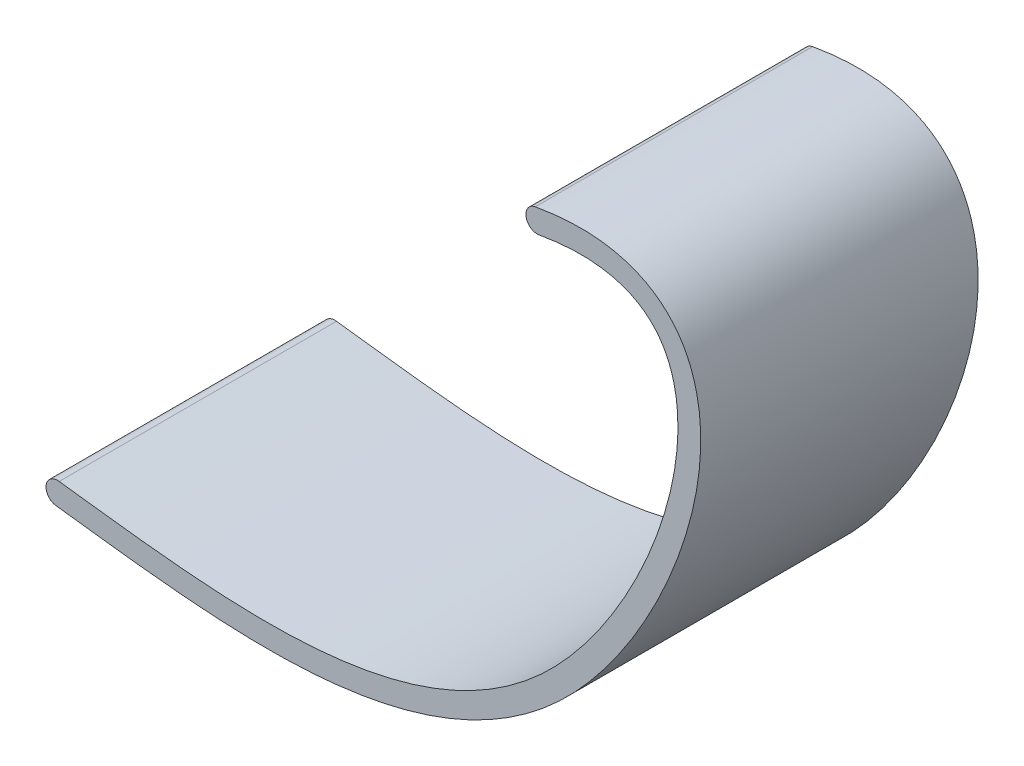
ISO-10303-21;
HEADER;
FILE_DESCRIPTION(('STEP AP214'),'2;1');
FILE_NAME('part.step','',(''),(''),'','','');
FILE_SCHEMA(('AUTOMOTIVE_DESIGN { 1 0 10303 214 1 1 1 1 }'));
ENDSEC;
DATA;
#1=APPLICATION_CONTEXT('core data for automotive mechanical design processes');
#2=APPLICATION_PROTOCOL_DEFINITION('international standard','automotive_design',2000,#1);
#3=PRODUCT_CONTEXT('',#1,'mechanical');
#4=PRODUCT('Part','Part','',(#3));
#5=PRODUCT_RELATED_PRODUCT_CATEGORY('part','',(#4));
#6=PRODUCT_DEFINITION_FORMATION('','',#4);
#7=PRODUCT_DEFINITION_CONTEXT('part definition',#1,'design');
#8=PRODUCT_DEFINITION('design','',#6,#7);
#9=PRODUCT_DEFINITION_SHAPE('','',#8);
#10=(LENGTH_UNIT() NAMED_UNIT(*) SI_UNIT(.MILLI.,.METRE.));
#11=(NAMED_UNIT(*) PLANE_ANGLE_UNIT() SI_UNIT($,.RADIAN.));
#12=(NAMED_UNIT(*) SI_UNIT($,.STERADIAN.) SOLID_ANGLE_UNIT());
#13=UNCERTAINTY_MEASURE_WITH_UNIT(LENGTH_MEASURE(1.E-05),#10,'distance_accuracy_value','');
#14=(GEOMETRIC_REPRESENTATION_CONTEXT(3) GLOBAL_UNCERTAINTY_ASSIGNED_CONTEXT((#13)) GLOBAL_UNIT_ASSIGNED_CONTEXT((#10,
#11,#12)) REPRESENTATION_CONTEXT('',''));
#15=CARTESIAN_POINT('',(0.,0.,0.));
#16=DIRECTION('',(0.,0.,1.));
#17=DIRECTION('',(1.,0.,0.));
#18=AXIS2_PLACEMENT_3D('',#15,#16,#17);
#19=CARTESIAN_POINT('',(10.2857672952948,-10.2788864664164,38.6715));
#20=DIRECTION('',(0.,0.,-1.));
#21=DIRECTION('',(-1.,0.,0.));
#22=AXIS2_PLACEMENT_3D('',#19,#20,#21);
#23=CYLINDRICAL_SURFACE('',#22,1.58010837673295);
#24=CARTESIAN_POINT('',(10.2857672952948,-10.2788864664164,0.));
#25=DIRECTION('',(0.,0.,1.));
#26=DIRECTION('',(1.,0.,0.));
#27=AXIS2_PLACEMENT_3D('',#24,#25,#26);
#28=CIRCLE('',#27,1.58010837673295);
#29=CARTESIAN_POINT('',(10.0063966460049,-8.72367120075803,0.));
#30=VERTEX_POINT('',#29);
#31=CARTESIAN_POINT('',(9.39180860040662,-8.97597421532066,0.));
#32=VERTEX_POINT('',#31);
#33=EDGE_CURVE('E114',#30,#32,#28,.T.);
#34=ORIENTED_EDGE('',*,*,#33,.T.);
#35=DIRECTION('',(0.,0.,-1.));
#36=VECTOR('',#35,1.);
#37=CARTESIAN_POINT('',(9.39180860040662,-8.97597421532066,38.6715));
#38=LINE('',#37,#36);
#39=CARTESIAN_POINT('',(9.39180860040662,-8.97597421532066,38.6715));
#40=VERTEX_POINT('',#39);
#41=EDGE_CURVE('E11',#40,#32,#38,.T.);
#42=ORIENTED_EDGE('',*,*,#41,.F.);
#43=CARTESIAN_POINT('',(10.2857672952948,-10.2788864664164,38.6715));
#44=DIRECTION('',(0.,0.,1.));
#45=DIRECTION('',(1.,0.,0.));
#46=AXIS2_PLACEMENT_3D('',#43,#44,#45);
#47=CIRCLE('',#46,1.58010837673295);
#48=CARTESIAN_POINT('',(10.0063966460049,-8.72367120075803,38.6715));
#49=VERTEX_POINT('',#48);
#50=EDGE_CURVE('E151',#49,#40,#47,.T.);
#51=ORIENTED_EDGE('',*,*,#50,.F.);
#52=DIRECTION('',(0.,0.,-1.));
#53=VECTOR('',#52,1.);
#54=CARTESIAN_POINT('',(10.0063966460049,-8.72367120075803,38.6715));
#55=LINE('',#54,#53);
#56=EDGE_CURVE('E49',#49,#30,#55,.T.);
#57=ORIENTED_EDGE('',*,*,#56,.T.);
#58=EDGE_LOOP('',(#34,#42,#51,#57));
#59=FACE_BOUND('',#58,.T.);
#60=ADVANCED_FACE('F33',(#59),#23,.T.);
#61=CARTESIAN_POINT('',(10.2906199236229,-10.2859589955331,38.6715));
#62=DIRECTION('',(0.,0.,-1.));
#63=DIRECTION('',(-1.,0.,0.));
#64=AXIS2_PLACEMENT_3D('',#61,#62,#63);
#65=CYLINDRICAL_SURFACE('',#64,1.58868559480152);
#66=CARTESIAN_POINT('',(10.2906199236229,-10.2859589955331,0.));
#67=DIRECTION('',(0.,0.,1.));
#68=DIRECTION('',(1.,0.,0.));
#69=AXIS2_PLACEMENT_3D('',#66,#67,#68);
#70=CIRCLE('',#69,1.58868559480152);
#71=CARTESIAN_POINT('',(10.5675489634716,-11.8503221969726,0.));
#72=VERTEX_POINT('',#71);
#73=EDGE_CURVE('E134',#32,#72,#70,.T.);
#74=ORIENTED_EDGE('',*,*,#73,.T.);
#75=DIRECTION('',(0.,0.,-1.));
#76=VECTOR('',#75,1.);
#77=CARTESIAN_POINT('',(10.5675489634716,-11.8503221969726,38.6715));
#78=LINE('',#77,#76);
#79=CARTESIAN_POINT('',(10.5675489634716,-11.8503221969726,38.6715));
#80=VERTEX_POINT('',#79);
#81=EDGE_CURVE('E41',#80,#72,#78,.T.);
#82=ORIENTED_EDGE('',*,*,#81,.F.);
#83=CARTESIAN_POINT('',(10.2906199236229,-10.2859589955331,38.6715));
#84=DIRECTION('',(0.,0.,1.));
#85=DIRECTION('',(1.,0.,0.));
#86=AXIS2_PLACEMENT_3D('',#83,#84,#85);
#87=CIRCLE('',#86,1.58868559480152);
#88=EDGE_CURVE('E79',#40,#80,#87,.T.);
#89=ORIENTED_EDGE('',*,*,#88,.F.);
#90=ORIENTED_EDGE('',*,*,#41,.T.);
#91=EDGE_LOOP('',(#74,#82,#89,#90));
#92=FACE_BOUND('',#91,.T.);
#93=ADVANCED_FACE('F129',(#92),#65,.T.);
#94=CARTESIAN_POINT('',(10.5675489634716,-11.8503221969726,38.6715));
#95=CARTESIAN_POINT('',(11.0642695253859,-11.761093940948,38.6715));
#96=CARTESIAN_POINT('',(12.0804910314256,-11.5977119637513,38.6715));
#97=CARTESIAN_POINT('',(13.9682084489983,-11.3708905984152,38.6715));
#98=CARTESIAN_POINT('',(16.1668956542674,-11.2496898321451,38.6715));
#99=CARTESIAN_POINT('',(18.5188657018003,-11.3509997340582,38.6715));
#100=CARTESIAN_POINT('',(21.2955393989933,-11.7854432316714,38.6715));
#101=CARTESIAN_POINT('',(24.1116793601625,-12.8346898568114,38.6715));
#102=CARTESIAN_POINT('',(26.6016971242371,-14.755146671119,38.6715));
#103=CARTESIAN_POINT('',(28.3799951486649,-17.3068240590897,38.6715));
#104=CARTESIAN_POINT('',(29.8880822601615,-21.5631075830279,38.6715));
#105=CARTESIAN_POINT('',(30.1362513253272,-28.3287276214096,38.6715));
#106=CARTESIAN_POINT('',(27.9996834452661,-37.7909203264839,38.6715));
#107=CARTESIAN_POINT('',(23.8493985247126,-47.6112804882945,38.6715));
#108=CARTESIAN_POINT('',(18.1416832629057,-56.8868624159512,38.6715));
#109=CARTESIAN_POINT('',(11.3939513206749,-64.6650027748084,38.6715));
#110=CARTESIAN_POINT('',(4.03620816578925,-70.261276273228,38.6715));
#111=CARTESIAN_POINT('',(-6.5194069739132,-75.378809609236,38.6715));
#112=CARTESIAN_POINT('',(-17.9888439713043,-77.4950744431977,38.6715));
#113=CARTESIAN_POINT('',(-29.8767159052418,-77.681570233991,38.6715));
#114=CARTESIAN_POINT('',(-38.8562759748321,-77.1259057140243,38.6715));
#115=CARTESIAN_POINT('',(-46.2666393970062,-76.3161705066154,38.6715));
#116=CARTESIAN_POINT('',(-52.0992986233003,-75.5992361225084,38.6715));
#117=CARTESIAN_POINT('',(-54.9424272922319,-75.2451267783178,38.6715));
#118=CARTESIAN_POINT('',(-56.3736153767311,-75.0714000232605,38.6715));
#119=B_SPLINE_CURVE_WITH_KNOTS('',3,(#94,#95,#96,#97,#98,#99,#100,#101,#102,#103,#104,#105,#106,
#107,#108,#109,#110,#111,#112,#113,#114,#115,#116,#117,#118),.UNSPECIFIED.,.F.,.F.,(4,1,1,1,1,1,
1,1,1,1,1,1,1,1,1,1,1,1,1,1,1,1,4),(0.,0.0078125,0.015625,0.03125,0.046875,0.0625,0.09375,0.125,
0.15625,0.1875,0.25,0.3125,0.375,0.4375,0.5,0.5625,0.625,0.75,0.8125,0.875,0.9375,0.96875,1.),.UNSPECIFIED.);
#120=DIRECTION('',(0.,0.,-1.));
#121=VECTOR('',#120,1.);
#122=SURFACE_OF_LINEAR_EXTRUSION('',#119,#121);
#123=CARTESIAN_POINT('',(10.5675489634716,-11.8503221969726,0.));
#124=CARTESIAN_POINT('',(11.0642695253859,-11.761093940948,0.));
#125=CARTESIAN_POINT('',(12.0804910314256,-11.5977119637513,0.));
#126=CARTESIAN_POINT('',(13.9682084489983,-11.3708905984152,0.));
#127=CARTESIAN_POINT('',(16.1668956542674,-11.2496898321451,0.));
#128=CARTESIAN_POINT('',(18.5188657018003,-11.3509997340582,0.));
#129=CARTESIAN_POINT('',(21.2955393989933,-11.7854432316714,0.));
#130=CARTESIAN_POINT('',(24.1116793601625,-12.8346898568114,0.));
#131=CARTESIAN_POINT('',(26.6016971242371,-14.755146671119,0.));
#132=CARTESIAN_POINT('',(28.3799951486649,-17.3068240590897,0.));
#133=CARTESIAN_POINT('',(29.8880822601615,-21.5631075830279,0.));
#134=CARTESIAN_POINT('',(30.1362513253272,-28.3287276214096,0.));
#135=CARTESIAN_POINT('',(27.9996834452661,-37.7909203264839,0.));
#136=CARTESIAN_POINT('',(23.8493985247126,-47.6112804882945,0.));
#137=CARTESIAN_POINT('',(18.1416832629057,-56.8868624159512,0.));
#138=CARTESIAN_POINT('',(11.3939513206749,-64.6650027748084,0.));
#139=CARTESIAN_POINT('',(4.03620816578925,-70.261276273228,0.));
#140=CARTESIAN_POINT('',(-6.5194069739132,-75.378809609236,0.));
#141=CARTESIAN_POINT('',(-17.9888439713043,-77.4950744431977,0.));
#142=CARTESIAN_POINT('',(-29.8767159052418,-77.681570233991,0.));
#143=CARTESIAN_POINT('',(-38.8562759748321,-77.1259057140243,0.));
#144=CARTESIAN_POINT('',(-46.2666393970062,-76.3161705066154,0.));
#145=CARTESIAN_POINT('',(-52.0992986233003,-75.5992361225084,0.));
#146=CARTESIAN_POINT('',(-54.9424272922319,-75.2451267783178,0.));
#147=CARTESIAN_POINT('',(-56.3736153767311,-75.0714000232605,0.));
#148=B_SPLINE_CURVE_WITH_KNOTS('',3,(#123,#124,#125,#126,#127,#128,#129,#130,#131,#132,#133,
#134,#135,#136,#137,#138,#139,#140,#141,#142,#143,#144,#145,#146,#147),.UNSPECIFIED.,.F.,.F.,(4,
1,1,1,1,1,1,1,1,1,1,1,1,1,1,1,1,1,1,1,1,1,4),(0.,0.0078125,0.015625,0.03125,0.046875,0.0625,
0.09375,0.125,0.15625,0.1875,0.25,0.3125,0.375,0.4375,0.5,0.5625,0.625,0.75,0.8125,0.875,0.9375,
0.96875,1.),.UNSPECIFIED.);
#149=CARTESIAN_POINT('',(-56.3736153767311,-75.0714000232605,0.));
#150=VERTEX_POINT('',#149);
#151=EDGE_CURVE('E98',#72,#150,#148,.T.);
#152=ORIENTED_EDGE('',*,*,#151,.T.);
#153=DIRECTION('',(0.,0.,-1.));
#154=VECTOR('',#153,1.);
#155=CARTESIAN_POINT('',(-56.3736153767311,-75.0714000232605,38.6715));
#156=LINE('',#155,#154);
#157=CARTESIAN_POINT('',(-56.3736153767311,-75.0714000232605,38.6715));
#158=VERTEX_POINT('',#157);
#159=EDGE_CURVE('E95',#158,#150,#156,.T.);
#160=ORIENTED_EDGE('',*,*,#159,.F.);
#161=EDGE_CURVE('E85',#80,#158,#119,.T.);
#162=ORIENTED_EDGE('',*,*,#161,.F.);
#163=ORIENTED_EDGE('',*,*,#81,.T.);
#164=EDGE_LOOP('',(#152,#160,#162,#163));
#165=FACE_BOUND('',#164,.T.);
#166=ADVANCED_FACE('F96',(#165),#122,.F.);
#167=CARTESIAN_POINT('',(-56.6161068109009,-76.6402703666459,38.6715));
#168=DIRECTION('',(0.,0.,-1.));
#169=DIRECTION('',(-1.,0.,0.));
#170=AXIS2_PLACEMENT_3D('',#167,#168,#169);
#171=CYLINDRICAL_SURFACE('',#170,1.5875);
#172=CARTESIAN_POINT('',(-56.6161068109009,-76.6402703666459,0.));
#173=DIRECTION('',(0.,0.,1.));
#174=DIRECTION('',(1.,0.,0.));
#175=AXIS2_PLACEMENT_3D('',#172,#173,#174);
#176=CIRCLE('',#175,1.5875);
#177=CARTESIAN_POINT('',(-56.7560060522432,-78.2215940059657,0.));
#178=VERTEX_POINT('',#177);
#179=EDGE_CURVE('E138',#150,#178,#176,.T.);
#180=ORIENTED_EDGE('',*,*,#179,.T.);
#181=DIRECTION('',(0.,0.,-1.));
#182=VECTOR('',#181,1.);
#183=CARTESIAN_POINT('',(-56.7560060522432,-78.2215940059657,38.6715));
#184=LINE('',#183,#182);
#185=CARTESIAN_POINT('',(-56.7560060522432,-78.2215940059657,38.6715));
#186=VERTEX_POINT('',#185);
#187=EDGE_CURVE('E67',#186,#178,#184,.T.);
#188=ORIENTED_EDGE('',*,*,#187,.F.);
#189=CARTESIAN_POINT('',(-56.6161068109009,-76.6402703666459,38.6715));
#190=DIRECTION('',(0.,0.,1.));
#191=DIRECTION('',(1.,0.,0.));
#192=AXIS2_PLACEMENT_3D('',#189,#190,#191);
#193=CIRCLE('',#192,1.5875);
#194=EDGE_CURVE('E90',#158,#186,#193,.T.);
#195=ORIENTED_EDGE('',*,*,#194,.F.);
#196=ORIENTED_EDGE('',*,*,#159,.T.);
#197=EDGE_LOOP('',(#180,#188,#195,#196));
#198=FACE_BOUND('',#197,.T.);
#199=ADVANCED_FACE('F102',(#198),#171,.T.);
#200=CARTESIAN_POINT('',(10.0063966460049,-8.72367120075803,38.6715));
#201=CARTESIAN_POINT('',(10.5424279697674,-8.62738136727579,38.6715));
#202=CARTESIAN_POINT('',(11.6353928553702,-8.4516299551712,38.6715));
#203=CARTESIAN_POINT('',(13.6946522070226,-8.20387250358403,38.6715));
#204=CARTESIAN_POINT('',(16.131840761882,-8.0682395325121,38.6715));
#205=CARTESIAN_POINT('',(18.8159517991855,-8.18163174209265,38.6715));
#206=CARTESIAN_POINT('',(22.0936002090617,-8.69057989386662,38.6715));
#207=CARTESIAN_POINT('',(25.6323245076545,-9.9871942364915,38.6715));
#208=CARTESIAN_POINT('',(28.9456892385248,-12.5320255503351,38.6715));
#209=CARTESIAN_POINT('',(31.2620160858776,-15.8805967696401,38.6715));
#210=CARTESIAN_POINT('',(32.6334467724211,-19.8070464150677,38.6715));
#211=CARTESIAN_POINT('',(33.1771359849479,-24.1612211363316,38.6715));
#212=CARTESIAN_POINT('',(32.9350053867867,-30.4027495056383,38.6715));
#213=CARTESIAN_POINT('',(31.0254887931558,-38.8001034496776,38.6715));
#214=CARTESIAN_POINT('',(26.6781951121525,-49.0756983085613,38.6715));
#215=CARTESIAN_POINT('',(20.7293399418235,-58.7486683372929,38.6715));
#216=CARTESIAN_POINT('',(13.6019566262544,-66.9757478535602,38.6715));
#217=CARTESIAN_POINT('',(5.71010116422495,-72.9845600062406,38.6715));
#218=CARTESIAN_POINT('',(-2.76454628059788,-77.0884823390503,38.6715));
#219=CARTESIAN_POINT('',(-11.6403933257248,-79.5613631799309,38.6715));
#220=CARTESIAN_POINT('',(-20.7557105781915,-80.7149889898242,38.6715));
#221=CARTESIAN_POINT('',(-29.9668480394213,-80.8565820631033,38.6715));
#222=CARTESIAN_POINT('',(-39.1423086642103,-80.2874030517751,38.6715));
#223=CARTESIAN_POINT('',(-46.6365751492745,-79.4679065097886,38.6715));
#224=CARTESIAN_POINT('',(-52.4947867427647,-78.7478207476536,38.6715));
#225=CARTESIAN_POINT('',(-55.3272288941511,-78.3950281073698,38.6715));
#226=CARTESIAN_POINT('',(-56.7560060522432,-78.2215940059657,38.6715));
#227=B_SPLINE_CURVE_WITH_KNOTS('',3,(#200,#201,#202,#203,#204,#205,#206,#207,#208,#209,#210,
#211,#212,#213,#214,#215,#216,#217,#218,#219,#220,#221,#222,#223,#224,#225,#226),.UNSPECIFIED.,
.F.,.F.,(4,1,1,1,1,1,1,1,1,1,1,1,1,1,1,1,1,1,1,1,1,1,1,1,4),(0.,0.0078125,0.015625,0.03125,
0.046875,0.0625,0.09375,0.125,0.15625,0.1875,0.21875,0.25,0.3125,0.375,0.4375,0.5,0.5625,0.625,
0.6875,0.75,0.8125,0.875,0.9375,0.96875,1.),.UNSPECIFIED.);
#228=DIRECTION('',(0.,0.,-1.));
#229=VECTOR('',#228,1.);
#230=SURFACE_OF_LINEAR_EXTRUSION('',#227,#229);
#231=CARTESIAN_POINT('',(10.0063966460049,-8.72367120075803,0.));
#232=CARTESIAN_POINT('',(10.5424279697674,-8.62738136727579,0.));
#233=CARTESIAN_POINT('',(11.6353928553702,-8.4516299551712,0.));
#234=CARTESIAN_POINT('',(13.6946522070226,-8.20387250358403,0.));
#235=CARTESIAN_POINT('',(16.131840761882,-8.0682395325121,0.));
#236=CARTESIAN_POINT('',(18.8159517991855,-8.18163174209265,0.));
#237=CARTESIAN_POINT('',(22.0936002090617,-8.69057989386662,0.));
#238=CARTESIAN_POINT('',(25.6323245076545,-9.9871942364915,0.));
#239=CARTESIAN_POINT('',(28.9456892385248,-12.5320255503351,0.));
#240=CARTESIAN_POINT('',(31.2620160858776,-15.8805967696401,0.));
#241=CARTESIAN_POINT('',(32.6334467724211,-19.8070464150677,0.));
#242=CARTESIAN_POINT('',(33.1771359849479,-24.1612211363316,0.));
#243=CARTESIAN_POINT('',(32.9350053867867,-30.4027495056383,0.));
#244=CARTESIAN_POINT('',(31.0254887931558,-38.8001034496776,0.));
#245=CARTESIAN_POINT('',(26.6781951121525,-49.0756983085613,0.));
#246=CARTESIAN_POINT('',(20.7293399418235,-58.7486683372929,0.));
#247=CARTESIAN_POINT('',(13.6019566262544,-66.9757478535602,0.));
#248=CARTESIAN_POINT('',(5.71010116422495,-72.9845600062406,0.));
#249=CARTESIAN_POINT('',(-2.76454628059788,-77.0884823390503,0.));
#250=CARTESIAN_POINT('',(-11.6403933257248,-79.5613631799309,0.));
#251=CARTESIAN_POINT('',(-20.7557105781915,-80.7149889898242,0.));
#252=CARTESIAN_POINT('',(-29.9668480394213,-80.8565820631033,0.));
#253=CARTESIAN_POINT('',(-39.1423086642103,-80.2874030517751,0.));
#254=CARTESIAN_POINT('',(-46.6365751492745,-79.4679065097886,0.));
#255=CARTESIAN_POINT('',(-52.4947867427647,-78.7478207476536,0.));
#256=CARTESIAN_POINT('',(-55.3272288941511,-78.3950281073698,0.));
#257=CARTESIAN_POINT('',(-56.7560060522432,-78.2215940059657,0.));
#258=B_SPLINE_CURVE_WITH_KNOTS('',3,(#231,#232,#233,#234,#235,#236,#237,#238,#239,#240,#241,
#242,#243,#244,#245,#246,#247,#248,#249,#250,#251,#252,#253,#254,#255,#256,#257),.UNSPECIFIED.,
.F.,.F.,(4,1,1,1,1,1,1,1,1,1,1,1,1,1,1,1,1,1,1,1,1,1,1,1,4),(0.,0.0078125,0.015625,0.03125,
0.046875,0.0625,0.09375,0.125,0.15625,0.1875,0.21875,0.25,0.3125,0.375,0.4375,0.5,0.5625,0.625,
0.6875,0.75,0.8125,0.875,0.9375,0.96875,1.),.UNSPECIFIED.);
#259=EDGE_CURVE('E140',#30,#178,#258,.T.);
#260=ORIENTED_EDGE('',*,*,#259,.F.);
#261=ORIENTED_EDGE('',*,*,#56,.F.);
#262=EDGE_CURVE('E103',#49,#186,#227,.T.);
#263=ORIENTED_EDGE('',*,*,#262,.T.);
#264=ORIENTED_EDGE('',*,*,#187,.T.);
#265=EDGE_LOOP('',(#260,#261,#263,#264));
#266=FACE_BOUND('',#265,.T.);
#267=ADVANCED_FACE('F120',(#266),#230,.T.);
#268=CARTESIAN_POINT('',(10.2857672952948,-10.2788864664164,38.6715));
#269=DIRECTION('',(0.,0.,1.));
#270=DIRECTION('',(1.,0.,0.));
#271=AXIS2_PLACEMENT_3D('',#268,#269,#270);
#272=PLANE('',#271);
#273=ORIENTED_EDGE('',*,*,#50,.T.);
#274=ORIENTED_EDGE('',*,*,#88,.T.);
#275=ORIENTED_EDGE('',*,*,#161,.T.);
#276=ORIENTED_EDGE('',*,*,#194,.T.);
#277=ORIENTED_EDGE('',*,*,#262,.F.);
#278=EDGE_LOOP('',(#273,#274,#275,#276,#277));
#279=FACE_BOUND('',#278,.T.);
#280=ADVANCED_FACE('F87',(#279),#272,.T.);
#281=CARTESIAN_POINT('',(10.2857672952948,-10.2788864664164,0.));
#282=DIRECTION('',(0.,0.,1.));
#283=DIRECTION('',(1.,0.,0.));
#284=AXIS2_PLACEMENT_3D('',#281,#282,#283);
#285=PLANE('',#284);
#286=ORIENTED_EDGE('',*,*,#33,.F.);
#287=ORIENTED_EDGE('',*,*,#259,.T.);
#288=ORIENTED_EDGE('',*,*,#179,.F.);
#289=ORIENTED_EDGE('',*,*,#151,.F.);
#290=ORIENTED_EDGE('',*,*,#73,.F.);
#291=EDGE_LOOP('',(#286,#287,#288,#289,#290));
#292=FACE_BOUND('',#291,.T.);
#293=ADVANCED_FACE('F124',(#292),#285,.F.);
#294=CLOSED_SHELL('',(#60,#93,#166,#199,#267,#280,#293));
#295=MANIFOLD_SOLID_BREP('B2',#294);
#296=ADVANCED_BREP_SHAPE_REPRESENTATION('',(#18,#295),#14);
#297=SHAPE_DEFINITION_REPRESENTATION(#9,#296);
ENDSEC;
END-ISO-10303-21;
